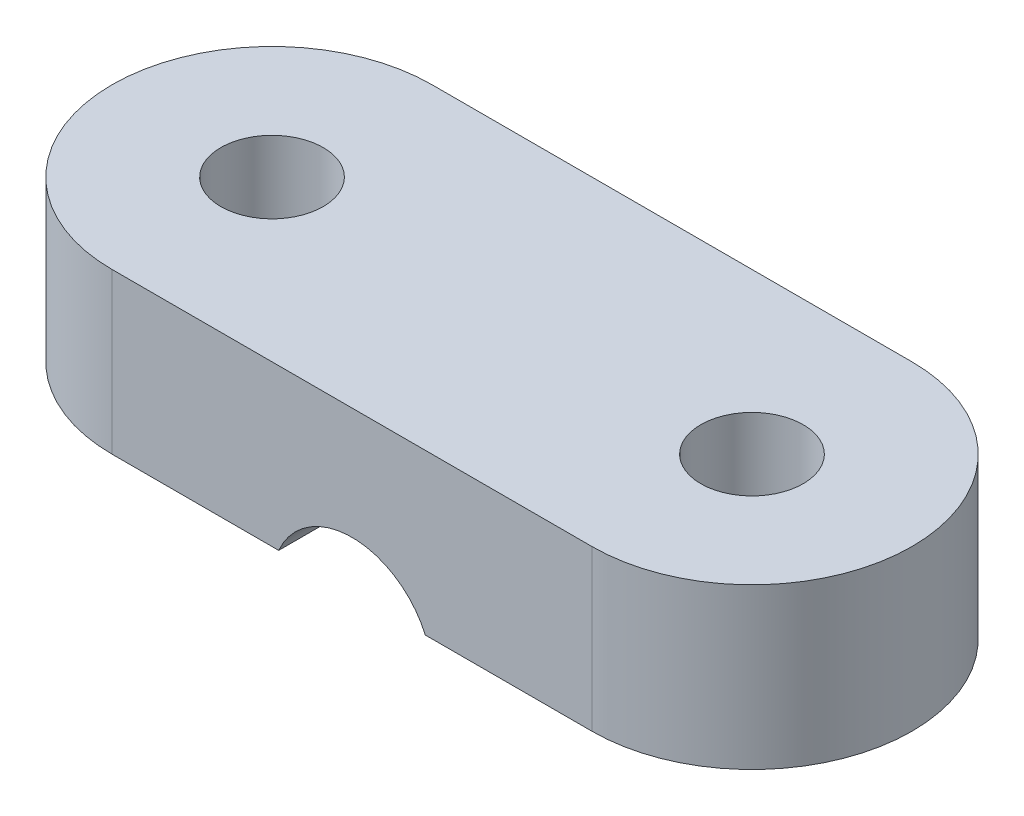
ISO-10303-21;
HEADER;
FILE_DESCRIPTION(('STEP AP214'),'2;1');
FILE_NAME('part.step','',(''),(''),'','','');
FILE_SCHEMA(('AUTOMOTIVE_DESIGN { 1 0 10303 214 1 1 1 1 }'));
ENDSEC;
DATA;
#1=APPLICATION_CONTEXT('core data for automotive mechanical design processes');
#2=APPLICATION_PROTOCOL_DEFINITION('international standard','automotive_design',2000,#1);
#3=PRODUCT_CONTEXT('',#1,'mechanical');
#4=PRODUCT('Part','Part','',(#3));
#5=PRODUCT_RELATED_PRODUCT_CATEGORY('part','',(#4));
#6=PRODUCT_DEFINITION_FORMATION('','',#4);
#7=PRODUCT_DEFINITION_CONTEXT('part definition',#1,'design');
#8=PRODUCT_DEFINITION('design','',#6,#7);
#9=PRODUCT_DEFINITION_SHAPE('','',#8);
#10=(LENGTH_UNIT() NAMED_UNIT(*) SI_UNIT(.MILLI.,.METRE.));
#11=(NAMED_UNIT(*) PLANE_ANGLE_UNIT() SI_UNIT($,.RADIAN.));
#12=(NAMED_UNIT(*) SI_UNIT($,.STERADIAN.) SOLID_ANGLE_UNIT());
#13=UNCERTAINTY_MEASURE_WITH_UNIT(LENGTH_MEASURE(1.E-05),#10,'distance_accuracy_value','');
#14=(GEOMETRIC_REPRESENTATION_CONTEXT(3) GLOBAL_UNCERTAINTY_ASSIGNED_CONTEXT((#13)) GLOBAL_UNIT_ASSIGNED_CONTEXT((#10,
#11,#12)) REPRESENTATION_CONTEXT('',''));
#15=CARTESIAN_POINT('',(0.,0.,0.));
#16=DIRECTION('',(0.,0.,1.));
#17=DIRECTION('',(1.,0.,0.));
#18=AXIS2_PLACEMENT_3D('',#15,#16,#17);
#19=CARTESIAN_POINT('',(-7.5,0.,0.));
#20=DIRECTION('',(0.,1.,0.));
#21=DIRECTION('',(0.,0.,1.));
#22=AXIS2_PLACEMENT_3D('',#19,#20,#21);
#23=PLANE('',#22);
#24=CARTESIAN_POINT('',(-7.5,0.,0.));
#25=DIRECTION('',(0.,1.,0.));
#26=DIRECTION('',(0.,0.,1.));
#27=AXIS2_PLACEMENT_3D('',#24,#25,#26);
#28=CIRCLE('',#27,1.6);
#29=CARTESIAN_POINT('',(-7.5,0.,1.6));
#30=VERTEX_POINT('',#29);
#31=EDGE_CURVE('E158',#30,#30,#28,.T.);
#32=ORIENTED_EDGE('',*,*,#31,.T.);
#33=EDGE_LOOP('',(#32));
#34=FACE_BOUND('',#33,.T.);
#35=DIRECTION('',(-1.,0.,0.));
#36=VECTOR('',#35,1.);
#37=CARTESIAN_POINT('',(-7.5,0.,-5.));
#38=LINE('',#37,#36);
#39=CARTESIAN_POINT('',(-2.29128784747792,0.,-5.));
#40=VERTEX_POINT('',#39);
#41=CARTESIAN_POINT('',(-7.5,0.,-5.));
#42=VERTEX_POINT('',#41);
#43=EDGE_CURVE('E84',#40,#42,#38,.T.);
#44=ORIENTED_EDGE('',*,*,#43,.F.);
#45=DIRECTION('',(0.,0.,1.));
#46=VECTOR('',#45,1.);
#47=CARTESIAN_POINT('',(-2.29128784747792,0.,-5.));
#48=LINE('',#47,#46);
#49=CARTESIAN_POINT('',(-2.29128784747792,0.,5.));
#50=VERTEX_POINT('',#49);
#51=EDGE_CURVE('E55',#40,#50,#48,.T.);
#52=ORIENTED_EDGE('',*,*,#51,.T.);
#53=DIRECTION('',(1.,0.,0.));
#54=VECTOR('',#53,1.);
#55=CARTESIAN_POINT('',(-7.5,0.,5.));
#56=LINE('',#55,#54);
#57=CARTESIAN_POINT('',(-7.5,0.,5.));
#58=VERTEX_POINT('',#57);
#59=EDGE_CURVE('E142',#58,#50,#56,.T.);
#60=ORIENTED_EDGE('',*,*,#59,.F.);
#61=CARTESIAN_POINT('',(-7.5,0.,0.));
#62=DIRECTION('',(0.,1.,0.));
#63=DIRECTION('',(0.,0.,1.));
#64=AXIS2_PLACEMENT_3D('',#61,#62,#63);
#65=CIRCLE('',#64,5.);
#66=EDGE_CURVE('E146',#42,#58,#65,.T.);
#67=ORIENTED_EDGE('',*,*,#66,.F.);
#68=EDGE_LOOP('',(#44,#52,#60,#67));
#69=FACE_BOUND('',#68,.T.);
#70=ADVANCED_FACE('F39',(#34,#69),#23,.F.);
#71=CARTESIAN_POINT('',(-7.5,5.,0.));
#72=DIRECTION('',(0.,1.,0.));
#73=DIRECTION('',(0.,0.,1.));
#74=AXIS2_PLACEMENT_3D('',#71,#72,#73);
#75=PLANE('',#74);
#76=CARTESIAN_POINT('',(-7.5,5.,0.));
#77=DIRECTION('',(0.,1.,0.));
#78=DIRECTION('',(0.,0.,1.));
#79=AXIS2_PLACEMENT_3D('',#76,#77,#78);
#80=CIRCLE('',#79,1.6);
#81=CARTESIAN_POINT('',(-7.5,5.,1.6));
#82=VERTEX_POINT('',#81);
#83=EDGE_CURVE('E151',#82,#82,#80,.T.);
#84=ORIENTED_EDGE('',*,*,#83,.F.);
#85=EDGE_LOOP('',(#84));
#86=FACE_BOUND('',#85,.T.);
#87=CARTESIAN_POINT('',(-7.5,5.,0.));
#88=DIRECTION('',(0.,1.,0.));
#89=DIRECTION('',(0.,0.,1.));
#90=AXIS2_PLACEMENT_3D('',#87,#88,#89);
#91=CIRCLE('',#90,5.);
#92=CARTESIAN_POINT('',(-7.5,5.,-5.));
#93=VERTEX_POINT('',#92);
#94=CARTESIAN_POINT('',(-7.5,5.,5.));
#95=VERTEX_POINT('',#94);
#96=EDGE_CURVE('E122',#93,#95,#91,.T.);
#97=ORIENTED_EDGE('',*,*,#96,.T.);
#98=DIRECTION('',(1.,0.,0.));
#99=VECTOR('',#98,1.);
#100=CARTESIAN_POINT('',(-7.5,5.,5.));
#101=LINE('',#100,#99);
#102=CARTESIAN_POINT('',(7.5,5.,5.));
#103=VERTEX_POINT('',#102);
#104=EDGE_CURVE('E91',#95,#103,#101,.T.);
#105=ORIENTED_EDGE('',*,*,#104,.T.);
#106=CARTESIAN_POINT('',(7.5,5.,0.));
#107=DIRECTION('',(0.,1.,0.));
#108=DIRECTION('',(0.,0.,1.));
#109=AXIS2_PLACEMENT_3D('',#106,#107,#108);
#110=CIRCLE('',#109,5.);
#111=CARTESIAN_POINT('',(7.5,5.,-5.));
#112=VERTEX_POINT('',#111);
#113=EDGE_CURVE('E140',#103,#112,#110,.T.);
#114=ORIENTED_EDGE('',*,*,#113,.T.);
#115=DIRECTION('',(-1.,0.,0.));
#116=VECTOR('',#115,1.);
#117=CARTESIAN_POINT('',(-7.5,5.,-5.));
#118=LINE('',#117,#116);
#119=EDGE_CURVE('E64',#112,#93,#118,.T.);
#120=ORIENTED_EDGE('',*,*,#119,.T.);
#121=EDGE_LOOP('',(#97,#105,#114,#120));
#122=FACE_BOUND('',#121,.T.);
#123=CARTESIAN_POINT('',(7.5,5.,0.));
#124=DIRECTION('',(0.,1.,0.));
#125=DIRECTION('',(0.,0.,1.));
#126=AXIS2_PLACEMENT_3D('',#123,#124,#125);
#127=CIRCLE('',#126,1.6);
#128=CARTESIAN_POINT('',(7.5,5.,1.6));
#129=VERTEX_POINT('',#128);
#130=EDGE_CURVE('E162',#129,#129,#127,.T.);
#131=ORIENTED_EDGE('',*,*,#130,.F.);
#132=EDGE_LOOP('',(#131));
#133=FACE_BOUND('',#132,.T.);
#134=ADVANCED_FACE('F181',(#86,#122,#133),#75,.T.);
#135=CARTESIAN_POINT('',(2.29128784747792,0.,5.));
#136=VERTEX_POINT('',#135);
#137=CARTESIAN_POINT('',(7.5,0.,5.));
#138=VERTEX_POINT('',#137);
#139=EDGE_CURVE('E114',#136,#138,#56,.T.);
#140=ORIENTED_EDGE('',*,*,#139,.F.);
#141=DIRECTION('',(0.,0.,1.));
#142=VECTOR('',#141,1.);
#143=CARTESIAN_POINT('',(2.29128784747792,0.,-5.));
#144=LINE('',#143,#142);
#145=CARTESIAN_POINT('',(2.29128784747792,0.,-5.));
#146=VERTEX_POINT('',#145);
#147=EDGE_CURVE('E101',#136,#146,#144,.F.);
#148=ORIENTED_EDGE('',*,*,#147,.T.);
#149=CARTESIAN_POINT('',(7.5,0.,-5.));
#150=VERTEX_POINT('',#149);
#151=EDGE_CURVE('E113',#150,#146,#38,.T.);
#152=ORIENTED_EDGE('',*,*,#151,.F.);
#153=CARTESIAN_POINT('',(7.5,0.,0.));
#154=DIRECTION('',(0.,1.,0.));
#155=DIRECTION('',(0.,0.,1.));
#156=AXIS2_PLACEMENT_3D('',#153,#154,#155);
#157=CIRCLE('',#156,5.);
#158=EDGE_CURVE('E127',#138,#150,#157,.T.);
#159=ORIENTED_EDGE('',*,*,#158,.F.);
#160=EDGE_LOOP('',(#140,#148,#152,#159));
#161=FACE_BOUND('',#160,.T.);
#162=CARTESIAN_POINT('',(7.5,0.,0.));
#163=DIRECTION('',(0.,1.,0.));
#164=DIRECTION('',(0.,0.,1.));
#165=AXIS2_PLACEMENT_3D('',#162,#163,#164);
#166=CIRCLE('',#165,1.6);
#167=CARTESIAN_POINT('',(7.5,0.,1.6));
#168=VERTEX_POINT('',#167);
#169=EDGE_CURVE('E166',#168,#168,#166,.T.);
#170=ORIENTED_EDGE('',*,*,#169,.T.);
#171=EDGE_LOOP('',(#170));
#172=FACE_BOUND('',#171,.T.);
#173=ADVANCED_FACE('F110',(#161,#172),#23,.F.);
#174=CARTESIAN_POINT('',(-7.5,5.,0.));
#175=DIRECTION('',(0.,-1.,0.));
#176=DIRECTION('',(0.,0.,-1.));
#177=AXIS2_PLACEMENT_3D('',#174,#175,#176);
#178=CYLINDRICAL_SURFACE('',#177,5.);
#179=ORIENTED_EDGE('',*,*,#66,.T.);
#180=DIRECTION('',(0.,-1.,0.));
#181=VECTOR('',#180,1.);
#182=CARTESIAN_POINT('',(-7.5,5.,5.));
#183=LINE('',#182,#181);
#184=EDGE_CURVE('E11',#95,#58,#183,.T.);
#185=ORIENTED_EDGE('',*,*,#184,.F.);
#186=ORIENTED_EDGE('',*,*,#96,.F.);
#187=DIRECTION('',(0.,-1.,0.));
#188=VECTOR('',#187,1.);
#189=CARTESIAN_POINT('',(-7.5,5.,-5.));
#190=LINE('',#189,#188);
#191=EDGE_CURVE('E131',#93,#42,#190,.T.);
#192=ORIENTED_EDGE('',*,*,#191,.T.);
#193=EDGE_LOOP('',(#179,#185,#186,#192));
#194=FACE_BOUND('',#193,.T.);
#195=ADVANCED_FACE('F41',(#194),#178,.T.);
#196=CARTESIAN_POINT('',(-7.5,5.,5.));
#197=DIRECTION('',(0.,0.,-1.));
#198=DIRECTION('',(-1.,0.,0.));
#199=AXIS2_PLACEMENT_3D('',#196,#197,#198);
#200=PLANE('',#199);
#201=ORIENTED_EDGE('',*,*,#59,.T.);
#202=CARTESIAN_POINT('',(0.,-1.,5.));
#203=DIRECTION('',(0.,0.,1.));
#204=DIRECTION('',(1.,0.,0.));
#205=AXIS2_PLACEMENT_3D('',#202,#203,#204);
#206=CIRCLE('',#205,2.5);
#207=EDGE_CURVE('E105',#136,#50,#206,.T.);
#208=ORIENTED_EDGE('',*,*,#207,.F.);
#209=ORIENTED_EDGE('',*,*,#139,.T.);
#210=DIRECTION('',(0.,-1.,0.));
#211=VECTOR('',#210,1.);
#212=CARTESIAN_POINT('',(7.5,5.,5.));
#213=LINE('',#212,#211);
#214=EDGE_CURVE('E48',#103,#138,#213,.T.);
#215=ORIENTED_EDGE('',*,*,#214,.F.);
#216=ORIENTED_EDGE('',*,*,#104,.F.);
#217=ORIENTED_EDGE('',*,*,#184,.T.);
#218=EDGE_LOOP('',(#201,#208,#209,#215,#216,#217));
#219=FACE_BOUND('',#218,.T.);
#220=ADVANCED_FACE('F199',(#219),#200,.F.);
#221=CARTESIAN_POINT('',(7.5,5.,0.));
#222=DIRECTION('',(0.,-1.,0.));
#223=DIRECTION('',(0.,0.,-1.));
#224=AXIS2_PLACEMENT_3D('',#221,#222,#223);
#225=CYLINDRICAL_SURFACE('',#224,5.);
#226=ORIENTED_EDGE('',*,*,#158,.T.);
#227=DIRECTION('',(0.,-1.,0.));
#228=VECTOR('',#227,1.);
#229=CARTESIAN_POINT('',(7.5,5.,-5.));
#230=LINE('',#229,#228);
#231=EDGE_CURVE('E120',#112,#150,#230,.T.);
#232=ORIENTED_EDGE('',*,*,#231,.F.);
#233=ORIENTED_EDGE('',*,*,#113,.F.);
#234=ORIENTED_EDGE('',*,*,#214,.T.);
#235=EDGE_LOOP('',(#226,#232,#233,#234));
#236=FACE_BOUND('',#235,.T.);
#237=ADVANCED_FACE('F139',(#236),#225,.T.);
#238=CARTESIAN_POINT('',(-7.5,5.,-5.));
#239=DIRECTION('',(0.,0.,1.));
#240=DIRECTION('',(1.,0.,0.));
#241=AXIS2_PLACEMENT_3D('',#238,#239,#240);
#242=PLANE('',#241);
#243=ORIENTED_EDGE('',*,*,#151,.T.);
#244=CARTESIAN_POINT('',(0.,-1.,-5.));
#245=DIRECTION('',(0.,0.,1.));
#246=DIRECTION('',(1.,0.,0.));
#247=AXIS2_PLACEMENT_3D('',#244,#245,#246);
#248=CIRCLE('',#247,2.5);
#249=EDGE_CURVE('E98',#146,#40,#248,.T.);
#250=ORIENTED_EDGE('',*,*,#249,.T.);
#251=ORIENTED_EDGE('',*,*,#43,.T.);
#252=ORIENTED_EDGE('',*,*,#191,.F.);
#253=ORIENTED_EDGE('',*,*,#119,.F.);
#254=ORIENTED_EDGE('',*,*,#231,.T.);
#255=EDGE_LOOP('',(#243,#250,#251,#252,#253,#254));
#256=FACE_BOUND('',#255,.T.);
#257=ADVANCED_FACE('F118',(#256),#242,.F.);
#258=CARTESIAN_POINT('',(-7.5,5.,0.));
#259=DIRECTION('',(0.,-1.,0.));
#260=DIRECTION('',(0.,0.,-1.));
#261=AXIS2_PLACEMENT_3D('',#258,#259,#260);
#262=CYLINDRICAL_SURFACE('',#261,1.6);
#263=ORIENTED_EDGE('',*,*,#83,.T.);
#264=EDGE_LOOP('',(#263));
#265=FACE_BOUND('',#264,.T.);
#266=ORIENTED_EDGE('',*,*,#31,.F.);
#267=EDGE_LOOP('',(#266));
#268=FACE_BOUND('',#267,.T.);
#269=ADVANCED_FACE('F191',(#265,#268),#262,.F.);
#270=CARTESIAN_POINT('',(7.5,5.,0.));
#271=DIRECTION('',(0.,-1.,0.));
#272=DIRECTION('',(0.,0.,-1.));
#273=AXIS2_PLACEMENT_3D('',#270,#271,#272);
#274=CYLINDRICAL_SURFACE('',#273,1.6);
#275=ORIENTED_EDGE('',*,*,#130,.T.);
#276=EDGE_LOOP('',(#275));
#277=FACE_BOUND('',#276,.T.);
#278=ORIENTED_EDGE('',*,*,#169,.F.);
#279=EDGE_LOOP('',(#278));
#280=FACE_BOUND('',#279,.T.);
#281=ADVANCED_FACE('F188',(#277,#280),#274,.F.);
#282=CARTESIAN_POINT('',(0.,-1.,-5.));
#283=DIRECTION('',(0.,0.,1.));
#284=DIRECTION('',(1.,0.,0.));
#285=AXIS2_PLACEMENT_3D('',#282,#283,#284);
#286=CYLINDRICAL_SURFACE('',#285,2.5);
#287=ORIENTED_EDGE('',*,*,#249,.F.);
#288=ORIENTED_EDGE('',*,*,#147,.F.);
#289=ORIENTED_EDGE('',*,*,#207,.T.);
#290=ORIENTED_EDGE('',*,*,#51,.F.);
#291=EDGE_LOOP('',(#287,#288,#289,#290));
#292=FACE_BOUND('',#291,.T.);
#293=ADVANCED_FACE('F100',(#292),#286,.F.);
#294=CLOSED_SHELL('',(#70,#134,#173,#195,#220,#237,#257,#269,#281,#293));
#295=MANIFOLD_SOLID_BREP('B2',#294);
#296=ADVANCED_BREP_SHAPE_REPRESENTATION('',(#18,#295),#14);
#297=SHAPE_DEFINITION_REPRESENTATION(#9,#296);
ENDSEC;
END-ISO-10303-21;
